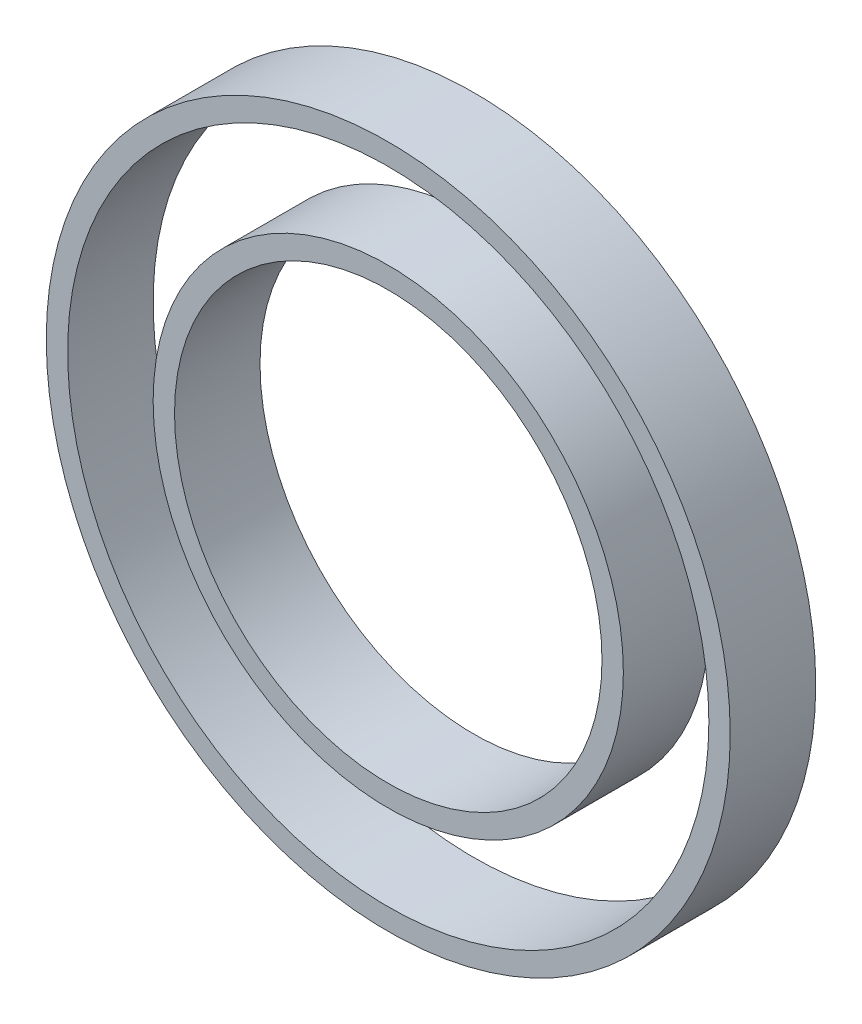
ISO-10303-21;
HEADER;
FILE_DESCRIPTION(('STEP AP214'),'2;1');
FILE_NAME('part.step','',(''),(''),'','','');
FILE_SCHEMA(('AUTOMOTIVE_DESIGN { 1 0 10303 214 1 1 1 1 }'));
ENDSEC;
DATA;
#1=APPLICATION_CONTEXT('core data for automotive mechanical design processes');
#2=APPLICATION_PROTOCOL_DEFINITION('international standard','automotive_design',2000,#1);
#3=PRODUCT_CONTEXT('',#1,'mechanical');
#4=PRODUCT('Part','Part','',(#3));
#5=PRODUCT_RELATED_PRODUCT_CATEGORY('part','',(#4));
#6=PRODUCT_DEFINITION_FORMATION('','',#4);
#7=PRODUCT_DEFINITION_CONTEXT('part definition',#1,'design');
#8=PRODUCT_DEFINITION('design','',#6,#7);
#9=PRODUCT_DEFINITION_SHAPE('','',#8);
#10=(LENGTH_UNIT() NAMED_UNIT(*) SI_UNIT(.MILLI.,.METRE.));
#11=(NAMED_UNIT(*) PLANE_ANGLE_UNIT() SI_UNIT($,.RADIAN.));
#12=(NAMED_UNIT(*) SI_UNIT($,.STERADIAN.) SOLID_ANGLE_UNIT());
#13=UNCERTAINTY_MEASURE_WITH_UNIT(LENGTH_MEASURE(1.E-05),#10,'distance_accuracy_value','');
#14=(GEOMETRIC_REPRESENTATION_CONTEXT(3) GLOBAL_UNCERTAINTY_ASSIGNED_CONTEXT((#13)) GLOBAL_UNIT_ASSIGNED_CONTEXT((#10,
#11,#12)) REPRESENTATION_CONTEXT('',''));
#15=CARTESIAN_POINT('',(0.,0.,0.));
#16=DIRECTION('',(0.,0.,1.));
#17=DIRECTION('',(1.,0.,0.));
#18=AXIS2_PLACEMENT_3D('',#15,#16,#17);
#19=CARTESIAN_POINT('',(0.,0.,2.));
#20=DIRECTION('',(0.,0.,-1.));
#21=DIRECTION('',(-1.,0.,0.));
#22=AXIS2_PLACEMENT_3D('',#19,#20,#21);
#23=CYLINDRICAL_SURFACE('',#22,5.);
#24=CARTESIAN_POINT('',(0.,0.,2.));
#25=DIRECTION('',(0.,0.,1.));
#26=DIRECTION('',(1.,0.,0.));
#27=AXIS2_PLACEMENT_3D('',#24,#25,#26);
#28=CIRCLE('',#27,5.);
#29=CARTESIAN_POINT('',(5.,0.,2.));
#30=VERTEX_POINT('',#29);
#31=EDGE_CURVE('E60',#30,#30,#28,.T.);
#32=ORIENTED_EDGE('',*,*,#31,.T.);
#33=EDGE_LOOP('',(#32));
#34=FACE_BOUND('',#33,.T.);
#35=CARTESIAN_POINT('',(0.,0.,0.));
#36=DIRECTION('',(0.,0.,1.));
#37=DIRECTION('',(1.,0.,0.));
#38=AXIS2_PLACEMENT_3D('',#35,#36,#37);
#39=CIRCLE('',#38,5.);
#40=CARTESIAN_POINT('',(5.,0.,0.));
#41=VERTEX_POINT('',#40);
#42=EDGE_CURVE('E66',#41,#41,#39,.T.);
#43=ORIENTED_EDGE('',*,*,#42,.F.);
#44=EDGE_LOOP('',(#43));
#45=FACE_BOUND('',#44,.T.);
#46=ADVANCED_FACE('F53',(#34,#45),#23,.F.);
#47=CARTESIAN_POINT('',(0.,0.,2.));
#48=DIRECTION('',(0.,0.,-1.));
#49=DIRECTION('',(-1.,0.,0.));
#50=AXIS2_PLACEMENT_3D('',#47,#48,#49);
#51=CYLINDRICAL_SURFACE('',#50,5.5);
#52=CARTESIAN_POINT('',(0.,0.,2.));
#53=DIRECTION('',(0.,0.,1.));
#54=DIRECTION('',(1.,0.,0.));
#55=AXIS2_PLACEMENT_3D('',#52,#53,#54);
#56=CIRCLE('',#55,5.5);
#57=CARTESIAN_POINT('',(5.5,0.,2.));
#58=VERTEX_POINT('',#57);
#59=EDGE_CURVE('E12',#58,#58,#56,.T.);
#60=ORIENTED_EDGE('',*,*,#59,.F.);
#61=EDGE_LOOP('',(#60));
#62=FACE_BOUND('',#61,.T.);
#63=CARTESIAN_POINT('',(0.,0.,0.));
#64=DIRECTION('',(0.,0.,1.));
#65=DIRECTION('',(1.,0.,0.));
#66=AXIS2_PLACEMENT_3D('',#63,#64,#65);
#67=CIRCLE('',#66,5.5);
#68=CARTESIAN_POINT('',(5.5,0.,0.));
#69=VERTEX_POINT('',#68);
#70=EDGE_CURVE('E56',#69,#69,#67,.T.);
#71=ORIENTED_EDGE('',*,*,#70,.T.);
#72=EDGE_LOOP('',(#71));
#73=FACE_BOUND('',#72,.T.);
#74=ADVANCED_FACE('F73',(#62,#73),#51,.T.);
#75=CARTESIAN_POINT('',(0.,0.,2.));
#76=DIRECTION('',(0.,0.,1.));
#77=DIRECTION('',(1.,0.,0.));
#78=AXIS2_PLACEMENT_3D('',#75,#76,#77);
#79=PLANE('',#78);
#80=ORIENTED_EDGE('',*,*,#31,.F.);
#81=EDGE_LOOP('',(#80));
#82=FACE_BOUND('',#81,.T.);
#83=ORIENTED_EDGE('',*,*,#59,.T.);
#84=EDGE_LOOP('',(#83));
#85=FACE_BOUND('',#84,.T.);
#86=ADVANCED_FACE('F77',(#82,#85),#79,.T.);
#87=CARTESIAN_POINT('',(0.,0.,0.));
#88=DIRECTION('',(0.,0.,1.));
#89=DIRECTION('',(1.,0.,0.));
#90=AXIS2_PLACEMENT_3D('',#87,#88,#89);
#91=PLANE('',#90);
#92=ORIENTED_EDGE('',*,*,#42,.T.);
#93=EDGE_LOOP('',(#92));
#94=FACE_BOUND('',#93,.T.);
#95=ORIENTED_EDGE('',*,*,#70,.F.);
#96=EDGE_LOOP('',(#95));
#97=FACE_BOUND('',#96,.T.);
#98=ADVANCED_FACE('F75',(#94,#97),#91,.F.);
#99=CLOSED_SHELL('',(#46,#74,#86,#98));
#100=MANIFOLD_SOLID_BREP('B2',#99);
#101=CARTESIAN_POINT('',(0.,0.,2.));
#102=DIRECTION('',(0.,0.,-1.));
#103=DIRECTION('',(-1.,0.,0.));
#104=AXIS2_PLACEMENT_3D('',#101,#102,#103);
#105=CYLINDRICAL_SURFACE('',#104,7.5);
#106=CARTESIAN_POINT('',(0.,0.,2.));
#107=DIRECTION('',(0.,0.,1.));
#108=DIRECTION('',(1.,0.,0.));
#109=AXIS2_PLACEMENT_3D('',#106,#107,#108);
#110=CIRCLE('',#109,7.5);
#111=CARTESIAN_POINT('',(7.5,0.,2.));
#112=VERTEX_POINT('',#111);
#113=EDGE_CURVE('E123',#112,#112,#110,.T.);
#114=ORIENTED_EDGE('',*,*,#113,.T.);
#115=EDGE_LOOP('',(#114));
#116=FACE_BOUND('',#115,.T.);
#117=CARTESIAN_POINT('',(0.,0.,0.));
#118=DIRECTION('',(0.,0.,1.));
#119=DIRECTION('',(1.,0.,0.));
#120=AXIS2_PLACEMENT_3D('',#117,#118,#119);
#121=CIRCLE('',#120,7.5);
#122=CARTESIAN_POINT('',(7.5,0.,0.));
#123=VERTEX_POINT('',#122);
#124=EDGE_CURVE('E130',#123,#123,#121,.T.);
#125=ORIENTED_EDGE('',*,*,#124,.F.);
#126=EDGE_LOOP('',(#125));
#127=FACE_BOUND('',#126,.T.);
#128=ADVANCED_FACE('F115',(#116,#127),#105,.F.);
#129=CARTESIAN_POINT('',(0.,0.,2.));
#130=DIRECTION('',(0.,0.,-1.));
#131=DIRECTION('',(-1.,0.,0.));
#132=AXIS2_PLACEMENT_3D('',#129,#130,#131);
#133=CYLINDRICAL_SURFACE('',#132,8.);
#134=CARTESIAN_POINT('',(0.,0.,2.));
#135=DIRECTION('',(0.,0.,1.));
#136=DIRECTION('',(1.,0.,0.));
#137=AXIS2_PLACEMENT_3D('',#134,#135,#136);
#138=CIRCLE('',#137,8.);
#139=CARTESIAN_POINT('',(8.,0.,2.));
#140=VERTEX_POINT('',#139);
#141=EDGE_CURVE('E52',#140,#140,#138,.T.);
#142=ORIENTED_EDGE('',*,*,#141,.F.);
#143=EDGE_LOOP('',(#142));
#144=FACE_BOUND('',#143,.T.);
#145=CARTESIAN_POINT('',(0.,0.,0.));
#146=DIRECTION('',(0.,0.,1.));
#147=DIRECTION('',(1.,0.,0.));
#148=AXIS2_PLACEMENT_3D('',#145,#146,#147);
#149=CIRCLE('',#148,8.);
#150=CARTESIAN_POINT('',(8.,0.,0.));
#151=VERTEX_POINT('',#150);
#152=EDGE_CURVE('E118',#151,#151,#149,.T.);
#153=ORIENTED_EDGE('',*,*,#152,.T.);
#154=EDGE_LOOP('',(#153));
#155=FACE_BOUND('',#154,.T.);
#156=ADVANCED_FACE('F139',(#144,#155),#133,.T.);
#157=CARTESIAN_POINT('',(0.,0.,2.));
#158=DIRECTION('',(0.,0.,1.));
#159=DIRECTION('',(1.,0.,0.));
#160=AXIS2_PLACEMENT_3D('',#157,#158,#159);
#161=PLANE('',#160);
#162=ORIENTED_EDGE('',*,*,#113,.F.);
#163=EDGE_LOOP('',(#162));
#164=FACE_BOUND('',#163,.T.);
#165=ORIENTED_EDGE('',*,*,#141,.T.);
#166=EDGE_LOOP('',(#165));
#167=FACE_BOUND('',#166,.T.);
#168=ADVANCED_FACE('F143',(#164,#167),#161,.T.);
#169=CARTESIAN_POINT('',(0.,0.,0.));
#170=DIRECTION('',(0.,0.,1.));
#171=DIRECTION('',(1.,0.,0.));
#172=AXIS2_PLACEMENT_3D('',#169,#170,#171);
#173=PLANE('',#172);
#174=ORIENTED_EDGE('',*,*,#124,.T.);
#175=EDGE_LOOP('',(#174));
#176=FACE_BOUND('',#175,.T.);
#177=ORIENTED_EDGE('',*,*,#152,.F.);
#178=EDGE_LOOP('',(#177));
#179=FACE_BOUND('',#178,.T.);
#180=ADVANCED_FACE('F141',(#176,#179),#173,.F.);
#181=CLOSED_SHELL('',(#128,#156,#168,#180));
#182=MANIFOLD_SOLID_BREP('B7',#181);
#183=ADVANCED_BREP_SHAPE_REPRESENTATION('',(#18,#100,#182),#14);
#184=SHAPE_DEFINITION_REPRESENTATION(#9,#183);
ENDSEC;
END-ISO-10303-21;
